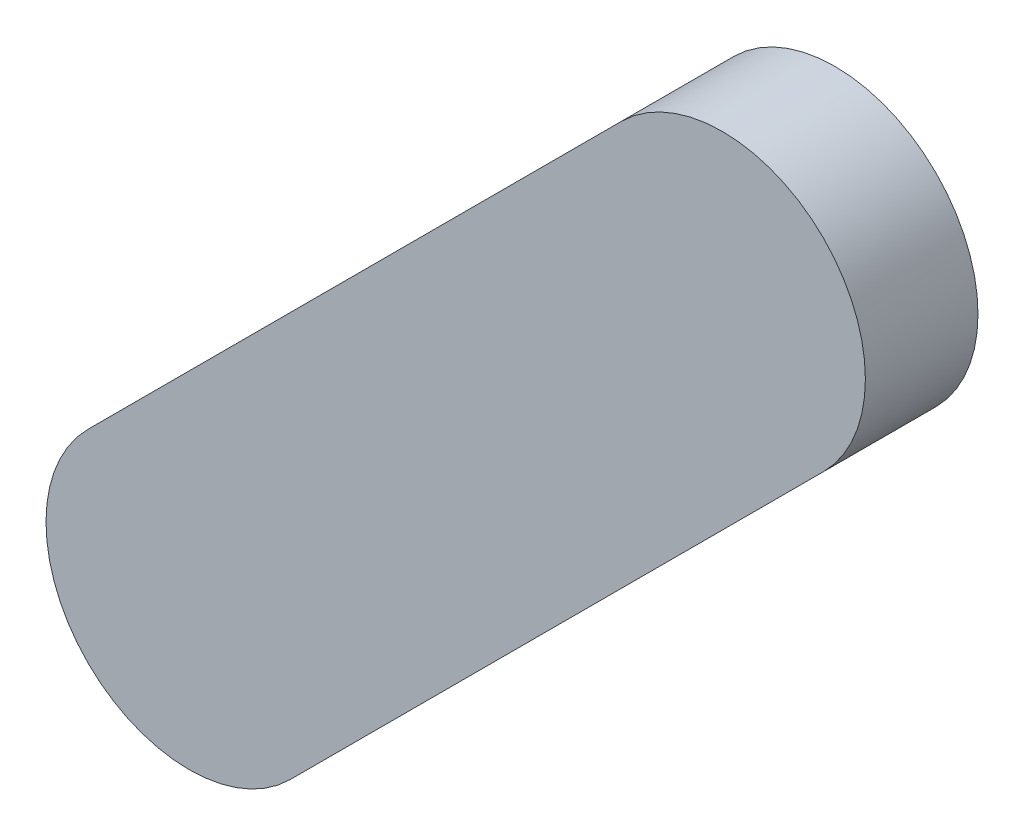
ISO-10303-21;
HEADER;
FILE_DESCRIPTION(('STEP AP214'),'2;1');
FILE_NAME('part.step','',(''),(''),'','','');
FILE_SCHEMA(('AUTOMOTIVE_DESIGN { 1 0 10303 214 1 1 1 1 }'));
ENDSEC;
DATA;
#1=APPLICATION_CONTEXT('core data for automotive mechanical design processes');
#2=APPLICATION_PROTOCOL_DEFINITION('international standard','automotive_design',2000,#1);
#3=PRODUCT_CONTEXT('',#1,'mechanical');
#4=PRODUCT('Part','Part','',(#3));
#5=PRODUCT_RELATED_PRODUCT_CATEGORY('part','',(#4));
#6=PRODUCT_DEFINITION_FORMATION('','',#4);
#7=PRODUCT_DEFINITION_CONTEXT('part definition',#1,'design');
#8=PRODUCT_DEFINITION('design','',#6,#7);
#9=PRODUCT_DEFINITION_SHAPE('','',#8);
#10=(LENGTH_UNIT() NAMED_UNIT(*) SI_UNIT(.MILLI.,.METRE.));
#11=(NAMED_UNIT(*) PLANE_ANGLE_UNIT() SI_UNIT($,.RADIAN.));
#12=(NAMED_UNIT(*) SI_UNIT($,.STERADIAN.) SOLID_ANGLE_UNIT());
#13=UNCERTAINTY_MEASURE_WITH_UNIT(LENGTH_MEASURE(1.E-05),#10,'distance_accuracy_value','');
#14=(GEOMETRIC_REPRESENTATION_CONTEXT(3) GLOBAL_UNCERTAINTY_ASSIGNED_CONTEXT((#13)) GLOBAL_UNIT_ASSIGNED_CONTEXT((#10,
#11,#12)) REPRESENTATION_CONTEXT('',''));
#15=CARTESIAN_POINT('',(0.,0.,0.));
#16=DIRECTION('',(0.,0.,1.));
#17=DIRECTION('',(1.,0.,0.));
#18=AXIS2_PLACEMENT_3D('',#15,#16,#17);
#19=CARTESIAN_POINT('',(150.80820994,107.59259406,0.));
#20=DIRECTION('',(-0.707106781186558,0.707106781186537,0.));
#21=DIRECTION('',(0.707106781186537,0.707106781186558,0.));
#22=AXIS2_PLACEMENT_3D('',#19,#20,#21);
#23=PLANE('',#22);
#24=DIRECTION('',(0.707106781186537,0.707106781186558,0.));
#25=VECTOR('',#24,1.);
#26=CARTESIAN_POINT('',(150.80820994,107.59259406,0.1999996));
#27=LINE('',#26,#25);
#28=CARTESIAN_POINT('',(150.80820994,107.59259406,0.1999996));
#29=VERTEX_POINT('',#28);
#30=CARTESIAN_POINT('',(151.75562994,108.54001406,0.1999996));
#31=VERTEX_POINT('',#30);
#32=EDGE_CURVE('E11',#29,#31,#27,.T.);
#33=ORIENTED_EDGE('',*,*,#32,.F.);
#34=DIRECTION('',(0.,0.,1.));
#35=VECTOR('',#34,1.);
#36=CARTESIAN_POINT('',(150.80820994,107.59259406,0.));
#37=LINE('',#36,#35);
#38=CARTESIAN_POINT('',(150.80820994,107.59259406,0.));
#39=VERTEX_POINT('',#38);
#40=EDGE_CURVE('E24',#39,#29,#37,.T.);
#41=ORIENTED_EDGE('',*,*,#40,.F.);
#42=DIRECTION('',(0.707106781186537,0.707106781186558,0.));
#43=VECTOR('',#42,1.);
#44=CARTESIAN_POINT('',(150.80820994,107.59259406,0.));
#45=LINE('',#44,#43);
#46=CARTESIAN_POINT('',(151.75562994,108.54001406,0.));
#47=VERTEX_POINT('',#46);
#48=EDGE_CURVE('E75',#39,#47,#45,.T.);
#49=ORIENTED_EDGE('',*,*,#48,.T.);
#50=DIRECTION('',(0.,0.,1.));
#51=VECTOR('',#50,1.);
#52=CARTESIAN_POINT('',(151.75562994,108.54001406,0.));
#53=LINE('',#52,#51);
#54=EDGE_CURVE('E37',#47,#31,#53,.T.);
#55=ORIENTED_EDGE('',*,*,#54,.T.);
#56=EDGE_LOOP('',(#33,#41,#49,#55));
#57=FACE_BOUND('',#56,.T.);
#58=ADVANCED_FACE('F17',(#57),#23,.F.);
#59=CARTESIAN_POINT('',(151.576024,108.71962,0.));
#60=DIRECTION('',(0.,0.,-1.));
#61=DIRECTION('',(0.707106781186604,-0.707106781186492,0.));
#62=AXIS2_PLACEMENT_3D('',#59,#60,#61);
#63=CYLINDRICAL_SURFACE('',#62,0.254001156230764);
#64=CARTESIAN_POINT('',(151.576024,108.71962,0.1999996));
#65=DIRECTION('',(0.,0.,1.));
#66=DIRECTION('',(0.707106781186604,-0.707106781186492,0.));
#67=AXIS2_PLACEMENT_3D('',#64,#65,#66);
#68=CIRCLE('',#67,0.254001156230764);
#69=CARTESIAN_POINT('',(151.39641806,108.89922594,0.1999996));
#70=VERTEX_POINT('',#69);
#71=EDGE_CURVE('E83',#31,#70,#68,.T.);
#72=ORIENTED_EDGE('',*,*,#71,.F.);
#73=ORIENTED_EDGE('',*,*,#54,.F.);
#74=CARTESIAN_POINT('',(151.576024,108.71962,0.));
#75=DIRECTION('',(0.,0.,1.));
#76=DIRECTION('',(0.707106781186604,-0.707106781186492,0.));
#77=AXIS2_PLACEMENT_3D('',#74,#75,#76);
#78=CIRCLE('',#77,0.254001156230764);
#79=CARTESIAN_POINT('',(151.39641806,108.89922594,0.));
#80=VERTEX_POINT('',#79);
#81=EDGE_CURVE('E81',#47,#80,#78,.T.);
#82=ORIENTED_EDGE('',*,*,#81,.T.);
#83=DIRECTION('',(0.,0.,1.));
#84=VECTOR('',#83,1.);
#85=CARTESIAN_POINT('',(151.39641806,108.89922594,0.));
#86=LINE('',#85,#84);
#87=EDGE_CURVE('E67',#80,#70,#86,.T.);
#88=ORIENTED_EDGE('',*,*,#87,.T.);
#89=EDGE_LOOP('',(#72,#73,#82,#88));
#90=FACE_BOUND('',#89,.T.);
#91=ADVANCED_FACE('F89',(#90),#63,.T.);
#92=CARTESIAN_POINT('',(151.39641806,108.89922594,0.));
#93=DIRECTION('',(0.707106781186548,-0.707106781186548,0.));
#94=DIRECTION('',(-0.707106781186548,-0.707106781186548,0.));
#95=AXIS2_PLACEMENT_3D('',#92,#93,#94);
#96=PLANE('',#95);
#97=DIRECTION('',(-0.707106781186548,-0.707106781186548,0.));
#98=VECTOR('',#97,1.);
#99=CARTESIAN_POINT('',(151.39641806,108.89922594,0.1999996));
#100=LINE('',#99,#98);
#101=CARTESIAN_POINT('',(150.44899806,107.95180594,0.1999996));
#102=VERTEX_POINT('',#101);
#103=EDGE_CURVE('E71',#70,#102,#100,.T.);
#104=ORIENTED_EDGE('',*,*,#103,.F.);
#105=ORIENTED_EDGE('',*,*,#87,.F.);
#106=DIRECTION('',(-0.707106781186548,-0.707106781186548,0.));
#107=VECTOR('',#106,1.);
#108=CARTESIAN_POINT('',(151.39641806,108.89922594,0.));
#109=LINE('',#108,#107);
#110=CARTESIAN_POINT('',(150.44899806,107.95180594,0.));
#111=VERTEX_POINT('',#110);
#112=EDGE_CURVE('E63',#80,#111,#109,.T.);
#113=ORIENTED_EDGE('',*,*,#112,.T.);
#114=DIRECTION('',(0.,0.,1.));
#115=VECTOR('',#114,1.);
#116=CARTESIAN_POINT('',(150.44899806,107.95180594,0.));
#117=LINE('',#116,#115);
#118=EDGE_CURVE('E53',#111,#102,#117,.T.);
#119=ORIENTED_EDGE('',*,*,#118,.T.);
#120=EDGE_LOOP('',(#104,#105,#113,#119));
#121=FACE_BOUND('',#120,.T.);
#122=ADVANCED_FACE('F66',(#121),#96,.F.);
#123=CARTESIAN_POINT('',(150.628604,107.7722,0.));
#124=DIRECTION('',(0.,0.,-1.));
#125=DIRECTION('',(-0.707106781186576,0.70710678118652,0.));
#126=AXIS2_PLACEMENT_3D('',#123,#124,#125);
#127=CYLINDRICAL_SURFACE('',#126,0.254001156230774);
#128=CARTESIAN_POINT('',(150.628604,107.7722,0.1999996));
#129=DIRECTION('',(0.,0.,1.));
#130=DIRECTION('',(-0.707106781186576,0.70710678118652,0.));
#131=AXIS2_PLACEMENT_3D('',#128,#129,#130);
#132=CIRCLE('',#131,0.254001156230774);
#133=EDGE_CURVE('E59',#102,#29,#132,.T.);
#134=ORIENTED_EDGE('',*,*,#133,.F.);
#135=ORIENTED_EDGE('',*,*,#118,.F.);
#136=CARTESIAN_POINT('',(150.628604,107.7722,0.));
#137=DIRECTION('',(0.,0.,1.));
#138=DIRECTION('',(-0.707106781186576,0.70710678118652,0.));
#139=AXIS2_PLACEMENT_3D('',#136,#137,#138);
#140=CIRCLE('',#139,0.254001156230774);
#141=EDGE_CURVE('E57',#111,#39,#140,.T.);
#142=ORIENTED_EDGE('',*,*,#141,.T.);
#143=ORIENTED_EDGE('',*,*,#40,.T.);
#144=EDGE_LOOP('',(#134,#135,#142,#143));
#145=FACE_BOUND('',#144,.T.);
#146=ADVANCED_FACE('F55',(#145),#127,.T.);
#147=CARTESIAN_POINT('',(150.80820994,107.59259406,0.));
#148=DIRECTION('',(0.,0.,-1.));
#149=DIRECTION('',(-1.,0.,0.));
#150=AXIS2_PLACEMENT_3D('',#147,#148,#149);
#151=PLANE('',#150);
#152=ORIENTED_EDGE('',*,*,#141,.F.);
#153=ORIENTED_EDGE('',*,*,#112,.F.);
#154=ORIENTED_EDGE('',*,*,#81,.F.);
#155=ORIENTED_EDGE('',*,*,#48,.F.);
#156=EDGE_LOOP('',(#152,#153,#154,#155));
#157=FACE_BOUND('',#156,.T.);
#158=ADVANCED_FACE('F74',(#157),#151,.T.);
#159=CARTESIAN_POINT('',(150.80820994,107.59259406,0.1999996));
#160=DIRECTION('',(0.,0.,-1.));
#161=DIRECTION('',(-1.,0.,0.));
#162=AXIS2_PLACEMENT_3D('',#159,#160,#161);
#163=PLANE('',#162);
#164=ORIENTED_EDGE('',*,*,#32,.T.);
#165=ORIENTED_EDGE('',*,*,#71,.T.);
#166=ORIENTED_EDGE('',*,*,#103,.T.);
#167=ORIENTED_EDGE('',*,*,#133,.T.);
#168=EDGE_LOOP('',(#164,#165,#166,#167));
#169=FACE_BOUND('',#168,.T.);
#170=ADVANCED_FACE('F91',(#169),#163,.F.);
#171=CLOSED_SHELL('',(#58,#91,#122,#146,#158,#170));
#172=MANIFOLD_SOLID_BREP('B1',#171);
#173=ADVANCED_BREP_SHAPE_REPRESENTATION('',(#18,#172),#14);
#174=SHAPE_DEFINITION_REPRESENTATION(#9,#173);
ENDSEC;
END-ISO-10303-21;
